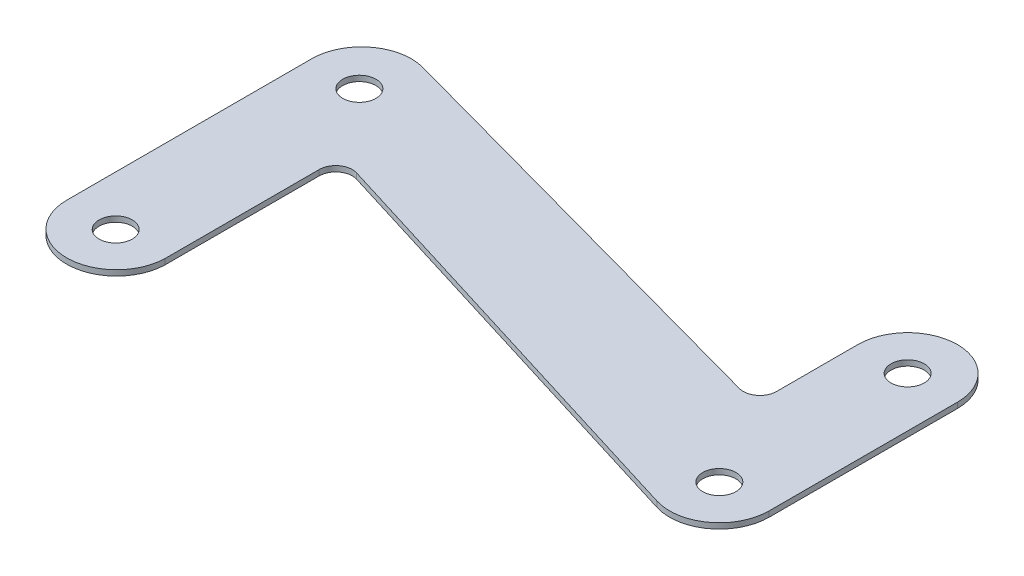
ISO-10303-21;
HEADER;
FILE_DESCRIPTION(('STEP AP214'),'2;1');
FILE_NAME('part.step','',(''),(''),'','','');
FILE_SCHEMA(('AUTOMOTIVE_DESIGN { 1 0 10303 214 1 1 1 1 }'));
ENDSEC;
DATA;
#1=APPLICATION_CONTEXT('core data for automotive mechanical design processes');
#2=APPLICATION_PROTOCOL_DEFINITION('international standard','automotive_design',2000,#1);
#3=PRODUCT_CONTEXT('',#1,'mechanical');
#4=PRODUCT('Part','Part','',(#3));
#5=PRODUCT_RELATED_PRODUCT_CATEGORY('part','',(#4));
#6=PRODUCT_DEFINITION_FORMATION('','',#4);
#7=PRODUCT_DEFINITION_CONTEXT('part definition',#1,'design');
#8=PRODUCT_DEFINITION('design','',#6,#7);
#9=PRODUCT_DEFINITION_SHAPE('','',#8);
#10=(LENGTH_UNIT() NAMED_UNIT(*) SI_UNIT(.MILLI.,.METRE.));
#11=(NAMED_UNIT(*) PLANE_ANGLE_UNIT() SI_UNIT($,.RADIAN.));
#12=(NAMED_UNIT(*) SI_UNIT($,.STERADIAN.) SOLID_ANGLE_UNIT());
#13=UNCERTAINTY_MEASURE_WITH_UNIT(LENGTH_MEASURE(1.E-05),#10,'distance_accuracy_value','');
#14=(GEOMETRIC_REPRESENTATION_CONTEXT(3) GLOBAL_UNCERTAINTY_ASSIGNED_CONTEXT((#13)) GLOBAL_UNIT_ASSIGNED_CONTEXT((#10,
#11,#12)) REPRESENTATION_CONTEXT('',''));
#15=CARTESIAN_POINT('',(0.,0.,0.));
#16=DIRECTION('',(0.,0.,1.));
#17=DIRECTION('',(1.,0.,0.));
#18=AXIS2_PLACEMENT_3D('',#15,#16,#17);
#19=CARTESIAN_POINT('',(-35.,1.,16.2602226268769));
#20=DIRECTION('',(0.,-1.,0.));
#21=DIRECTION('',(0.,0.,-1.));
#22=AXIS2_PLACEMENT_3D('',#19,#20,#21);
#23=CYLINDRICAL_SURFACE('',#22,3.);
#24=DIRECTION('',(0.,1.,0.));
#25=VECTOR('',#24,1.);
#26=CARTESIAN_POINT('',(-38.,1.,16.2602226268769));
#27=LINE('',#26,#25);
#28=CARTESIAN_POINT('',(-38.,0.,16.2602226268769));
#29=VERTEX_POINT('',#28);
#30=CARTESIAN_POINT('',(-38.,1.,16.2602226268769));
#31=VERTEX_POINT('',#30);
#32=EDGE_CURVE('E11',#29,#31,#27,.T.);
#33=ORIENTED_EDGE('',*,*,#32,.F.);
#34=CARTESIAN_POINT('',(-35.,0.,16.2602226268769));
#35=DIRECTION('',(0.,-1.,0.));
#36=DIRECTION('',(0.,0.,-1.));
#37=AXIS2_PLACEMENT_3D('',#34,#35,#36);
#38=CIRCLE('',#37,3.);
#39=CARTESIAN_POINT('',(-34.1155996982312,0.,13.3935457866608));
#40=VERTEX_POINT('',#39);
#41=EDGE_CURVE('E120',#29,#40,#38,.T.);
#42=ORIENTED_EDGE('',*,*,#41,.T.);
#43=DIRECTION('',(0.,1.,0.));
#44=VECTOR('',#43,1.);
#45=CARTESIAN_POINT('',(-34.1155996982312,1.,13.3935457866608));
#46=LINE('',#45,#44);
#47=CARTESIAN_POINT('',(-34.1155996982312,1.,13.3935457866608));
#48=VERTEX_POINT('',#47);
#49=EDGE_CURVE('E49',#40,#48,#46,.T.);
#50=ORIENTED_EDGE('',*,*,#49,.T.);
#51=CARTESIAN_POINT('',(-35.,1.,16.2602226268769));
#52=DIRECTION('',(0.,-1.,0.));
#53=DIRECTION('',(0.,0.,1.));
#54=AXIS2_PLACEMENT_3D('',#51,#52,#53);
#55=CIRCLE('',#54,3.);
#56=EDGE_CURVE('E192',#31,#48,#55,.T.);
#57=ORIENTED_EDGE('',*,*,#56,.F.);
#58=EDGE_LOOP('',(#33,#42,#50,#57));
#59=FACE_BOUND('',#58,.T.);
#60=ADVANCED_FACE('F39',(#59),#23,.F.);
#61=CARTESIAN_POINT('',(44.3467990946936,1.,37.6000305206482));
#62=DIRECTION('',(-0.294800100589597,0.,0.955558946738695));
#63=DIRECTION('',(0.955558946738695,0.,0.294800100589597));
#64=AXIS2_PLACEMENT_3D('',#61,#62,#63);
#65=PLANE('',#64);
#66=ORIENTED_EDGE('',*,*,#49,.F.);
#67=DIRECTION('',(0.955558946738695,0.,0.294800100589597));
#68=VECTOR('',#67,1.);
#69=CARTESIAN_POINT('',(44.3467990946936,0.,37.6000305206482));
#70=LINE('',#69,#68);
#71=CARTESIAN_POINT('',(44.3467990946936,0.,37.6000305206482));
#72=VERTEX_POINT('',#71);
#73=EDGE_CURVE('E154',#40,#72,#70,.T.);
#74=ORIENTED_EDGE('',*,*,#73,.T.);
#75=DIRECTION('',(0.,1.,0.));
#76=VECTOR('',#75,1.);
#77=CARTESIAN_POINT('',(44.3467990946936,1.,37.6000305206482));
#78=LINE('',#77,#76);
#79=CARTESIAN_POINT('',(44.3467990946936,1.,37.6000305206482));
#80=VERTEX_POINT('',#79);
#81=EDGE_CURVE('E185',#72,#80,#78,.T.);
#82=ORIENTED_EDGE('',*,*,#81,.T.);
#83=DIRECTION('',(0.955558946738695,0.,0.294800100589597));
#84=VECTOR('',#83,1.);
#85=CARTESIAN_POINT('',(44.3467990946936,1.,37.6000305206482));
#86=LINE('',#85,#84);
#87=EDGE_CURVE('E202',#48,#80,#86,.T.);
#88=ORIENTED_EDGE('',*,*,#87,.F.);
#89=EDGE_LOOP('',(#66,#74,#82,#88));
#90=FACE_BOUND('',#89,.T.);
#91=ADVANCED_FACE('F205',(#90),#65,.T.);
#92=CARTESIAN_POINT('',(47.,1.,29.));
#93=DIRECTION('',(0.,1.,0.));
#94=DIRECTION('',(0.,0.,1.));
#95=AXIS2_PLACEMENT_3D('',#92,#93,#94);
#96=CYLINDRICAL_SURFACE('',#95,9.00000000000001);
#97=ORIENTED_EDGE('',*,*,#81,.F.);
#98=CARTESIAN_POINT('',(47.,0.,29.));
#99=DIRECTION('',(0.,1.,0.));
#100=DIRECTION('',(0.,0.,1.));
#101=AXIS2_PLACEMENT_3D('',#98,#99,#100);
#102=CIRCLE('',#101,9.00000000000001);
#103=CARTESIAN_POINT('',(56.,0.,29.));
#104=VERTEX_POINT('',#103);
#105=EDGE_CURVE('E151',#72,#104,#102,.T.);
#106=ORIENTED_EDGE('',*,*,#105,.T.);
#107=DIRECTION('',(0.,1.,0.));
#108=VECTOR('',#107,1.);
#109=CARTESIAN_POINT('',(56.,1.,29.));
#110=LINE('',#109,#108);
#111=CARTESIAN_POINT('',(56.,1.,29.));
#112=VERTEX_POINT('',#111);
#113=EDGE_CURVE('E182',#104,#112,#110,.T.);
#114=ORIENTED_EDGE('',*,*,#113,.T.);
#115=CARTESIAN_POINT('',(47.,1.,29.));
#116=DIRECTION('',(0.,1.,0.));
#117=DIRECTION('',(0.,0.,-1.));
#118=AXIS2_PLACEMENT_3D('',#115,#116,#117);
#119=CIRCLE('',#118,9.00000000000001);
#120=EDGE_CURVE('E206',#80,#112,#119,.T.);
#121=ORIENTED_EDGE('',*,*,#120,.F.);
#122=EDGE_LOOP('',(#97,#106,#114,#121));
#123=FACE_BOUND('',#122,.T.);
#124=ADVANCED_FACE('F261',(#123),#96,.T.);
#125=CARTESIAN_POINT('',(56.,1.,29.));
#126=DIRECTION('',(1.,0.,0.));
#127=DIRECTION('',(0.,0.,-1.));
#128=AXIS2_PLACEMENT_3D('',#125,#126,#127);
#129=PLANE('',#128);
#130=ORIENTED_EDGE('',*,*,#113,.F.);
#131=DIRECTION('',(0.,0.,1.));
#132=VECTOR('',#131,1.);
#133=CARTESIAN_POINT('',(56.,0.,43.8636855391106));
#134=LINE('',#133,#132);
#135=CARTESIAN_POINT('',(56.,0.,-5.));
#136=VERTEX_POINT('',#135);
#137=EDGE_CURVE('E148',#104,#136,#134,.F.);
#138=ORIENTED_EDGE('',*,*,#137,.T.);
#139=DIRECTION('',(0.,1.,0.));
#140=VECTOR('',#139,1.);
#141=CARTESIAN_POINT('',(56.,1.,-5.));
#142=LINE('',#141,#140);
#143=CARTESIAN_POINT('',(56.,1.,-5.));
#144=VERTEX_POINT('',#143);
#145=EDGE_CURVE('E179',#136,#144,#142,.T.);
#146=ORIENTED_EDGE('',*,*,#145,.T.);
#147=DIRECTION('',(0.,0.,-1.));
#148=VECTOR('',#147,1.);
#149=CARTESIAN_POINT('',(56.,1.,29.));
#150=LINE('',#149,#148);
#151=EDGE_CURVE('E208',#112,#144,#150,.T.);
#152=ORIENTED_EDGE('',*,*,#151,.F.);
#153=EDGE_LOOP('',(#130,#138,#146,#152));
#154=FACE_BOUND('',#153,.T.);
#155=ADVANCED_FACE('F333',(#154),#129,.T.);
#156=CARTESIAN_POINT('',(47.,1.,-5.));
#157=DIRECTION('',(0.,1.,0.));
#158=DIRECTION('',(0.,0.,1.));
#159=AXIS2_PLACEMENT_3D('',#156,#157,#158);
#160=CYLINDRICAL_SURFACE('',#159,9.);
#161=ORIENTED_EDGE('',*,*,#145,.F.);
#162=CARTESIAN_POINT('',(47.,0.,-5.));
#163=DIRECTION('',(0.,1.,0.));
#164=DIRECTION('',(0.,0.,1.));
#165=AXIS2_PLACEMENT_3D('',#162,#163,#164);
#166=CIRCLE('',#165,9.);
#167=CARTESIAN_POINT('',(38.,0.,-5.));
#168=VERTEX_POINT('',#167);
#169=EDGE_CURVE('E145',#136,#168,#166,.T.);
#170=ORIENTED_EDGE('',*,*,#169,.T.);
#171=DIRECTION('',(0.,1.,0.));
#172=VECTOR('',#171,1.);
#173=CARTESIAN_POINT('',(38.,1.,-5.));
#174=LINE('',#173,#172);
#175=CARTESIAN_POINT('',(38.,1.,-5.));
#176=VERTEX_POINT('',#175);
#177=EDGE_CURVE('E176',#168,#176,#174,.T.);
#178=ORIENTED_EDGE('',*,*,#177,.T.);
#179=CARTESIAN_POINT('',(47.,1.,-5.));
#180=DIRECTION('',(0.,1.,0.));
#181=DIRECTION('',(0.,0.,-1.));
#182=AXIS2_PLACEMENT_3D('',#179,#180,#181);
#183=CIRCLE('',#182,9.);
#184=EDGE_CURVE('E214',#144,#176,#183,.T.);
#185=ORIENTED_EDGE('',*,*,#184,.F.);
#186=EDGE_LOOP('',(#161,#170,#178,#185));
#187=FACE_BOUND('',#186,.T.);
#188=ADVANCED_FACE('F328',(#187),#160,.T.);
#189=CARTESIAN_POINT('',(38.,1.,-5.));
#190=DIRECTION('',(-1.,0.,0.));
#191=DIRECTION('',(0.,0.,1.));
#192=AXIS2_PLACEMENT_3D('',#189,#190,#191);
#193=PLANE('',#192);
#194=ORIENTED_EDGE('',*,*,#177,.F.);
#195=DIRECTION('',(0.,0.,1.));
#196=VECTOR('',#195,1.);
#197=CARTESIAN_POINT('',(38.,0.,43.8636855391106));
#198=LINE('',#197,#196);
#199=CARTESIAN_POINT('',(38.,0.,9.67283728345838));
#200=VERTEX_POINT('',#199);
#201=EDGE_CURVE('E142',#168,#200,#198,.T.);
#202=ORIENTED_EDGE('',*,*,#201,.T.);
#203=DIRECTION('',(0.,1.,0.));
#204=VECTOR('',#203,1.);
#205=CARTESIAN_POINT('',(38.,1.,9.67283728345838));
#206=LINE('',#205,#204);
#207=CARTESIAN_POINT('',(38.,1.,9.67283728345838));
#208=VERTEX_POINT('',#207);
#209=EDGE_CURVE('E173',#200,#208,#206,.T.);
#210=ORIENTED_EDGE('',*,*,#209,.T.);
#211=DIRECTION('',(0.,0.,1.));
#212=VECTOR('',#211,1.);
#213=CARTESIAN_POINT('',(38.,1.,-5.));
#214=LINE('',#213,#212);
#215=EDGE_CURVE('E217',#176,#208,#214,.T.);
#216=ORIENTED_EDGE('',*,*,#215,.F.);
#217=EDGE_LOOP('',(#194,#202,#210,#216));
#218=FACE_BOUND('',#217,.T.);
#219=ADVANCED_FACE('F324',(#218),#193,.T.);
#220=CARTESIAN_POINT('',(35.,1.,9.67283728345838));
#221=DIRECTION('',(0.,-1.,0.));
#222=DIRECTION('',(0.,0.,-1.));
#223=AXIS2_PLACEMENT_3D('',#220,#221,#222);
#224=CYLINDRICAL_SURFACE('',#223,3.);
#225=ORIENTED_EDGE('',*,*,#209,.F.);
#226=CARTESIAN_POINT('',(35.,0.,9.67283728345838));
#227=DIRECTION('',(0.,-1.,0.));
#228=DIRECTION('',(0.,0.,-1.));
#229=AXIS2_PLACEMENT_3D('',#226,#227,#228);
#230=CIRCLE('',#229,3.);
#231=CARTESIAN_POINT('',(34.2058910236741,0.,12.5658272477892));
#232=VERTEX_POINT('',#231);
#233=EDGE_CURVE('E139',#200,#232,#230,.T.);
#234=ORIENTED_EDGE('',*,*,#233,.T.);
#235=DIRECTION('',(0.,1.,0.));
#236=VECTOR('',#235,1.);
#237=CARTESIAN_POINT('',(34.2058910236741,1.,12.5658272477892));
#238=LINE('',#237,#236);
#239=CARTESIAN_POINT('',(34.2058910236741,1.,12.5658272477892));
#240=VERTEX_POINT('',#239);
#241=EDGE_CURVE('E170',#232,#240,#238,.T.);
#242=ORIENTED_EDGE('',*,*,#241,.T.);
#243=CARTESIAN_POINT('',(35.,1.,9.67283728345838));
#244=DIRECTION('',(0.,-1.,0.));
#245=DIRECTION('',(0.,0.,1.));
#246=AXIS2_PLACEMENT_3D('',#243,#244,#245);
#247=CIRCLE('',#246,3.);
#248=EDGE_CURVE('E220',#208,#240,#247,.T.);
#249=ORIENTED_EDGE('',*,*,#248,.F.);
#250=EDGE_LOOP('',(#225,#234,#242,#249));
#251=FACE_BOUND('',#250,.T.);
#252=ADVANCED_FACE('F321',(#251),#224,.F.);
#253=CARTESIAN_POINT('',(-44.6176730710224,1.,-9.07078420449961));
#254=DIRECTION('',(0.264702992108624,0.,-0.964329988110264));
#255=DIRECTION('',(-0.964329988110264,0.,-0.264702992108624));
#256=AXIS2_PLACEMENT_3D('',#253,#254,#255);
#257=PLANE('',#256);
#258=ORIENTED_EDGE('',*,*,#241,.F.);
#259=DIRECTION('',(-0.964329988110264,0.,-0.264702992108624));
#260=VECTOR('',#259,1.);
#261=CARTESIAN_POINT('',(-44.6176730710224,0.,-9.07078420449961));
#262=LINE('',#261,#260);
#263=CARTESIAN_POINT('',(-44.6176730710224,0.,-9.07078420449961));
#264=VERTEX_POINT('',#263);
#265=EDGE_CURVE('E136',#232,#264,#262,.T.);
#266=ORIENTED_EDGE('',*,*,#265,.T.);
#267=DIRECTION('',(0.,1.,0.));
#268=VECTOR('',#267,1.);
#269=CARTESIAN_POINT('',(-44.6176730710224,1.,-9.07078420449961));
#270=LINE('',#269,#268);
#271=CARTESIAN_POINT('',(-44.6176730710224,1.,-9.07078420449961));
#272=VERTEX_POINT('',#271);
#273=EDGE_CURVE('E167',#264,#272,#270,.T.);
#274=ORIENTED_EDGE('',*,*,#273,.T.);
#275=DIRECTION('',(-0.964329988110264,0.,-0.264702992108624));
#276=VECTOR('',#275,1.);
#277=CARTESIAN_POINT('',(-44.6176730710224,1.,-9.07078420449961));
#278=LINE('',#277,#276);
#279=EDGE_CURVE('E223',#240,#272,#278,.T.);
#280=ORIENTED_EDGE('',*,*,#279,.F.);
#281=EDGE_LOOP('',(#258,#266,#274,#280));
#282=FACE_BOUND('',#281,.T.);
#283=ADVANCED_FACE('F311',(#282),#257,.T.);
#284=CARTESIAN_POINT('',(-47.,1.,-0.391814311507237));
#285=DIRECTION('',(0.,1.,0.));
#286=DIRECTION('',(0.,0.,1.));
#287=AXIS2_PLACEMENT_3D('',#284,#285,#286);
#288=CYLINDRICAL_SURFACE('',#287,9.);
#289=ORIENTED_EDGE('',*,*,#273,.F.);
#290=CARTESIAN_POINT('',(-47.,0.,-0.391814311507237));
#291=DIRECTION('',(0.,1.,0.));
#292=DIRECTION('',(0.,0.,1.));
#293=AXIS2_PLACEMENT_3D('',#290,#291,#292);
#294=CIRCLE('',#293,9.);
#295=CARTESIAN_POINT('',(-56.,0.,-0.391814311507234));
#296=VERTEX_POINT('',#295);
#297=EDGE_CURVE('E133',#264,#296,#294,.T.);
#298=ORIENTED_EDGE('',*,*,#297,.T.);
#299=DIRECTION('',(0.,1.,0.));
#300=VECTOR('',#299,1.);
#301=CARTESIAN_POINT('',(-56.,1.,-0.391814311507237));
#302=LINE('',#301,#300);
#303=CARTESIAN_POINT('',(-56.,1.,-0.391814311507237));
#304=VERTEX_POINT('',#303);
#305=EDGE_CURVE('E165',#296,#304,#302,.T.);
#306=ORIENTED_EDGE('',*,*,#305,.T.);
#307=CARTESIAN_POINT('',(-47.,1.,-0.391814311507237));
#308=DIRECTION('',(0.,1.,0.));
#309=DIRECTION('',(0.,0.,1.));
#310=AXIS2_PLACEMENT_3D('',#307,#308,#309);
#311=CIRCLE('',#310,9.);
#312=EDGE_CURVE('E226',#272,#304,#311,.T.);
#313=ORIENTED_EDGE('',*,*,#312,.F.);
#314=EDGE_LOOP('',(#289,#298,#306,#313));
#315=FACE_BOUND('',#314,.T.);
#316=ADVANCED_FACE('F317',(#315),#288,.T.);
#317=CARTESIAN_POINT('',(-56.,1.,43.8636855391106));
#318=DIRECTION('',(-1.,0.,0.));
#319=DIRECTION('',(0.,0.,1.));
#320=AXIS2_PLACEMENT_3D('',#317,#318,#319);
#321=PLANE('',#320);
#322=ORIENTED_EDGE('',*,*,#305,.F.);
#323=DIRECTION('',(0.,0.,1.));
#324=VECTOR('',#323,1.);
#325=CARTESIAN_POINT('',(-56.,0.,43.8636855391106));
#326=LINE('',#325,#324);
#327=CARTESIAN_POINT('',(-56.,0.,43.8636855391106));
#328=VERTEX_POINT('',#327);
#329=EDGE_CURVE('E130',#296,#328,#326,.T.);
#330=ORIENTED_EDGE('',*,*,#329,.T.);
#331=DIRECTION('',(0.,1.,0.));
#332=VECTOR('',#331,1.);
#333=CARTESIAN_POINT('',(-56.,1.,43.8636855391106));
#334=LINE('',#333,#332);
#335=CARTESIAN_POINT('',(-56.,1.,43.8636855391106));
#336=VERTEX_POINT('',#335);
#337=EDGE_CURVE('E57',#328,#336,#334,.T.);
#338=ORIENTED_EDGE('',*,*,#337,.T.);
#339=DIRECTION('',(0.,0.,1.));
#340=VECTOR('',#339,1.);
#341=CARTESIAN_POINT('',(-56.,1.,43.8636855391106));
#342=LINE('',#341,#340);
#343=EDGE_CURVE('E229',#304,#336,#342,.T.);
#344=ORIENTED_EDGE('',*,*,#343,.F.);
#345=EDGE_LOOP('',(#322,#330,#338,#344));
#346=FACE_BOUND('',#345,.T.);
#347=ADVANCED_FACE('F252',(#346),#321,.T.);
#348=CARTESIAN_POINT('',(-46.9979353741947,1.,43.8636855391106));
#349=DIRECTION('',(0.,1.,0.));
#350=DIRECTION('',(0.,0.,1.));
#351=AXIS2_PLACEMENT_3D('',#348,#349,#350);
#352=CYLINDRICAL_SURFACE('',#351,9.00206462580529);
#353=ORIENTED_EDGE('',*,*,#337,.F.);
#354=CARTESIAN_POINT('',(-46.9979353741947,0.,43.8636855391106));
#355=DIRECTION('',(0.,1.,0.));
#356=DIRECTION('',(0.,0.,1.));
#357=AXIS2_PLACEMENT_3D('',#354,#355,#356);
#358=CIRCLE('',#357,9.00206462580529);
#359=CARTESIAN_POINT('',(-38.,0.,44.1363144608896));
#360=VERTEX_POINT('',#359);
#361=EDGE_CURVE('E118',#328,#360,#358,.T.);
#362=ORIENTED_EDGE('',*,*,#361,.T.);
#363=DIRECTION('',(0.,1.,0.));
#364=VECTOR('',#363,1.);
#365=CARTESIAN_POINT('',(-38.,1.,44.1363144608894));
#366=LINE('',#365,#364);
#367=CARTESIAN_POINT('',(-38.,1.,44.1363144608894));
#368=VERTEX_POINT('',#367);
#369=EDGE_CURVE('E43',#360,#368,#366,.T.);
#370=ORIENTED_EDGE('',*,*,#369,.T.);
#371=CARTESIAN_POINT('',(-46.9979353741947,1.,43.8636855391106));
#372=DIRECTION('',(0.,1.,0.));
#373=DIRECTION('',(0.,0.,1.));
#374=AXIS2_PLACEMENT_3D('',#371,#372,#373);
#375=CIRCLE('',#374,9.00206462580529);
#376=EDGE_CURVE('E292',#336,#368,#375,.T.);
#377=ORIENTED_EDGE('',*,*,#376,.F.);
#378=EDGE_LOOP('',(#353,#362,#370,#377));
#379=FACE_BOUND('',#378,.T.);
#380=ADVANCED_FACE('F122',(#379),#352,.T.);
#381=CARTESIAN_POINT('',(-47.,1.,44.));
#382=DIRECTION('',(0.,1.,0.));
#383=DIRECTION('',(0.,0.,1.));
#384=AXIS2_PLACEMENT_3D('',#381,#382,#383);
#385=CYLINDRICAL_SURFACE('',#384,3.);
#386=CARTESIAN_POINT('',(-47.,1.,44.));
#387=DIRECTION('',(0.,1.,0.));
#388=DIRECTION('',(0.,0.,1.));
#389=AXIS2_PLACEMENT_3D('',#386,#387,#388);
#390=CIRCLE('',#389,3.);
#391=CARTESIAN_POINT('',(-47.,1.,47.));
#392=VERTEX_POINT('',#391);
#393=EDGE_CURVE('E163',#392,#392,#390,.T.);
#394=ORIENTED_EDGE('',*,*,#393,.T.);
#395=EDGE_LOOP('',(#394));
#396=FACE_BOUND('',#395,.T.);
#397=CARTESIAN_POINT('',(-47.,0.,44.));
#398=DIRECTION('',(0.,1.,0.));
#399=DIRECTION('',(0.,0.,1.));
#400=AXIS2_PLACEMENT_3D('',#397,#398,#399);
#401=CIRCLE('',#400,3.);
#402=CARTESIAN_POINT('',(-47.,0.,47.));
#403=VERTEX_POINT('',#402);
#404=EDGE_CURVE('E126',#403,#403,#401,.T.);
#405=ORIENTED_EDGE('',*,*,#404,.F.);
#406=EDGE_LOOP('',(#405));
#407=FACE_BOUND('',#406,.T.);
#408=ADVANCED_FACE('F241',(#396,#407),#385,.F.);
#409=CARTESIAN_POINT('',(-47.,1.,0.));
#410=DIRECTION('',(0.,1.,0.));
#411=DIRECTION('',(0.,0.,1.));
#412=AXIS2_PLACEMENT_3D('',#409,#410,#411);
#413=CYLINDRICAL_SURFACE('',#412,2.99999999999999);
#414=CARTESIAN_POINT('',(-47.,1.,0.));
#415=DIRECTION('',(0.,1.,0.));
#416=DIRECTION('',(0.,0.,1.));
#417=AXIS2_PLACEMENT_3D('',#414,#415,#416);
#418=CIRCLE('',#417,2.99999999999999);
#419=CARTESIAN_POINT('',(-47.,1.,2.99999999999999));
#420=VERTEX_POINT('',#419);
#421=EDGE_CURVE('E291',#420,#420,#418,.T.);
#422=ORIENTED_EDGE('',*,*,#421,.T.);
#423=EDGE_LOOP('',(#422));
#424=FACE_BOUND('',#423,.T.);
#425=CARTESIAN_POINT('',(-47.,0.,0.));
#426=DIRECTION('',(0.,1.,0.));
#427=DIRECTION('',(0.,0.,1.));
#428=AXIS2_PLACEMENT_3D('',#425,#426,#427);
#429=CIRCLE('',#428,2.99999999999999);
#430=CARTESIAN_POINT('',(-47.,0.,2.99999999999999));
#431=VERTEX_POINT('',#430);
#432=EDGE_CURVE('E123',#431,#431,#429,.T.);
#433=ORIENTED_EDGE('',*,*,#432,.F.);
#434=EDGE_LOOP('',(#433));
#435=FACE_BOUND('',#434,.T.);
#436=ADVANCED_FACE('F243',(#424,#435),#413,.F.);
#437=CARTESIAN_POINT('',(-38.,1.,16.2602226268769));
#438=DIRECTION('',(1.,0.,0.));
#439=DIRECTION('',(0.,0.,-1.));
#440=AXIS2_PLACEMENT_3D('',#437,#438,#439);
#441=PLANE('',#440);
#442=DIRECTION('',(0.,0.,1.));
#443=VECTOR('',#442,1.);
#444=CARTESIAN_POINT('',(-38.,0.,43.8636855391106));
#445=LINE('',#444,#443);
#446=EDGE_CURVE('E106',#360,#29,#445,.F.);
#447=ORIENTED_EDGE('',*,*,#446,.T.);
#448=ORIENTED_EDGE('',*,*,#32,.T.);
#449=DIRECTION('',(0.,0.,-1.));
#450=VECTOR('',#449,1.);
#451=CARTESIAN_POINT('',(-38.,1.,16.2602226268769));
#452=LINE('',#451,#450);
#453=EDGE_CURVE('E108',#368,#31,#452,.T.);
#454=ORIENTED_EDGE('',*,*,#453,.F.);
#455=ORIENTED_EDGE('',*,*,#369,.F.);
#456=EDGE_LOOP('',(#447,#448,#454,#455));
#457=FACE_BOUND('',#456,.T.);
#458=ADVANCED_FACE('F105',(#457),#441,.T.);
#459=CARTESIAN_POINT('',(47.,1.,29.));
#460=DIRECTION('',(0.,1.,0.));
#461=DIRECTION('',(0.,0.,1.));
#462=AXIS2_PLACEMENT_3D('',#459,#460,#461);
#463=CYLINDRICAL_SURFACE('',#462,3.);
#464=CARTESIAN_POINT('',(47.,1.,29.));
#465=DIRECTION('',(0.,1.,0.));
#466=DIRECTION('',(0.,0.,1.));
#467=AXIS2_PLACEMENT_3D('',#464,#465,#466);
#468=CIRCLE('',#467,3.);
#469=CARTESIAN_POINT('',(47.,1.,32.));
#470=VERTEX_POINT('',#469);
#471=EDGE_CURVE('E232',#470,#470,#468,.T.);
#472=ORIENTED_EDGE('',*,*,#471,.T.);
#473=EDGE_LOOP('',(#472));
#474=FACE_BOUND('',#473,.T.);
#475=CARTESIAN_POINT('',(47.,0.,29.));
#476=DIRECTION('',(0.,1.,0.));
#477=DIRECTION('',(0.,0.,1.));
#478=AXIS2_PLACEMENT_3D('',#475,#476,#477);
#479=CIRCLE('',#478,3.);
#480=CARTESIAN_POINT('',(47.,0.,32.));
#481=VERTEX_POINT('',#480);
#482=EDGE_CURVE('E132',#481,#481,#479,.T.);
#483=ORIENTED_EDGE('',*,*,#482,.F.);
#484=EDGE_LOOP('',(#483));
#485=FACE_BOUND('',#484,.T.);
#486=ADVANCED_FACE('F266',(#474,#485),#463,.F.);
#487=CARTESIAN_POINT('',(47.,1.,-5.));
#488=DIRECTION('',(0.,1.,0.));
#489=DIRECTION('',(0.,0.,1.));
#490=AXIS2_PLACEMENT_3D('',#487,#488,#489);
#491=CYLINDRICAL_SURFACE('',#490,3.);
#492=CARTESIAN_POINT('',(47.,1.,-5.));
#493=DIRECTION('',(0.,1.,0.));
#494=DIRECTION('',(0.,0.,1.));
#495=AXIS2_PLACEMENT_3D('',#492,#493,#494);
#496=CIRCLE('',#495,3.);
#497=CARTESIAN_POINT('',(47.,1.,-2.));
#498=VERTEX_POINT('',#497);
#499=EDGE_CURVE('E112',#498,#498,#496,.T.);
#500=ORIENTED_EDGE('',*,*,#499,.T.);
#501=EDGE_LOOP('',(#500));
#502=FACE_BOUND('',#501,.T.);
#503=CARTESIAN_POINT('',(47.,0.,-5.));
#504=DIRECTION('',(0.,1.,0.));
#505=DIRECTION('',(0.,0.,1.));
#506=AXIS2_PLACEMENT_3D('',#503,#504,#505);
#507=CIRCLE('',#506,3.);
#508=CARTESIAN_POINT('',(47.,0.,-2.));
#509=VERTEX_POINT('',#508);
#510=EDGE_CURVE('E160',#509,#509,#507,.T.);
#511=ORIENTED_EDGE('',*,*,#510,.F.);
#512=EDGE_LOOP('',(#511));
#513=FACE_BOUND('',#512,.T.);
#514=ADVANCED_FACE('F41',(#502,#513),#491,.F.);
#515=CARTESIAN_POINT('',(-46.9979353741947,1.,43.8636855391106));
#516=DIRECTION('',(0.,1.,0.));
#517=DIRECTION('',(0.,0.,1.));
#518=AXIS2_PLACEMENT_3D('',#515,#516,#517);
#519=PLANE('',#518);
#520=ORIENTED_EDGE('',*,*,#393,.F.);
#521=EDGE_LOOP('',(#520));
#522=FACE_BOUND('',#521,.T.);
#523=ORIENTED_EDGE('',*,*,#421,.F.);
#524=EDGE_LOOP('',(#523));
#525=FACE_BOUND('',#524,.T.);
#526=ORIENTED_EDGE('',*,*,#376,.T.);
#527=ORIENTED_EDGE('',*,*,#453,.T.);
#528=ORIENTED_EDGE('',*,*,#56,.T.);
#529=ORIENTED_EDGE('',*,*,#87,.T.);
#530=ORIENTED_EDGE('',*,*,#120,.T.);
#531=ORIENTED_EDGE('',*,*,#151,.T.);
#532=ORIENTED_EDGE('',*,*,#184,.T.);
#533=ORIENTED_EDGE('',*,*,#215,.T.);
#534=ORIENTED_EDGE('',*,*,#248,.T.);
#535=ORIENTED_EDGE('',*,*,#279,.T.);
#536=ORIENTED_EDGE('',*,*,#312,.T.);
#537=ORIENTED_EDGE('',*,*,#343,.T.);
#538=EDGE_LOOP('',(#526,#527,#528,#529,#530,#531,#532,#533,#534,#535,#536,#537));
#539=FACE_BOUND('',#538,.T.);
#540=ORIENTED_EDGE('',*,*,#471,.F.);
#541=EDGE_LOOP('',(#540));
#542=FACE_BOUND('',#541,.T.);
#543=ORIENTED_EDGE('',*,*,#499,.F.);
#544=EDGE_LOOP('',(#543));
#545=FACE_BOUND('',#544,.T.);
#546=ADVANCED_FACE('F199',(#522,#525,#539,#542,#545),#519,.T.);
#547=CARTESIAN_POINT('',(-46.9979353741947,0.,43.8636855391106));
#548=DIRECTION('',(0.,1.,0.));
#549=DIRECTION('',(0.,0.,1.));
#550=AXIS2_PLACEMENT_3D('',#547,#548,#549);
#551=PLANE('',#550);
#552=ORIENTED_EDGE('',*,*,#404,.T.);
#553=EDGE_LOOP('',(#552));
#554=FACE_BOUND('',#553,.T.);
#555=ORIENTED_EDGE('',*,*,#432,.T.);
#556=EDGE_LOOP('',(#555));
#557=FACE_BOUND('',#556,.T.);
#558=ORIENTED_EDGE('',*,*,#361,.F.);
#559=ORIENTED_EDGE('',*,*,#329,.F.);
#560=ORIENTED_EDGE('',*,*,#297,.F.);
#561=ORIENTED_EDGE('',*,*,#265,.F.);
#562=ORIENTED_EDGE('',*,*,#233,.F.);
#563=ORIENTED_EDGE('',*,*,#201,.F.);
#564=ORIENTED_EDGE('',*,*,#169,.F.);
#565=ORIENTED_EDGE('',*,*,#137,.F.);
#566=ORIENTED_EDGE('',*,*,#105,.F.);
#567=ORIENTED_EDGE('',*,*,#73,.F.);
#568=ORIENTED_EDGE('',*,*,#41,.F.);
#569=ORIENTED_EDGE('',*,*,#446,.F.);
#570=EDGE_LOOP('',(#558,#559,#560,#561,#562,#563,#564,#565,#566,#567,#568,#569));
#571=FACE_BOUND('',#570,.T.);
#572=ORIENTED_EDGE('',*,*,#482,.T.);
#573=EDGE_LOOP('',(#572));
#574=FACE_BOUND('',#573,.T.);
#575=ORIENTED_EDGE('',*,*,#510,.T.);
#576=EDGE_LOOP('',(#575));
#577=FACE_BOUND('',#576,.T.);
#578=ADVANCED_FACE('F115',(#554,#557,#571,#574,#577),#551,.F.);
#579=CLOSED_SHELL('',(#60,#91,#124,#155,#188,#219,#252,#283,#316,#347,#380,#408,#436,#458,#486,
#514,#546,#578));
#580=MANIFOLD_SOLID_BREP('B2',#579);
#581=ADVANCED_BREP_SHAPE_REPRESENTATION('',(#18,#580),#14);
#582=SHAPE_DEFINITION_REPRESENTATION(#9,#581);
ENDSEC;
END-ISO-10303-21;
